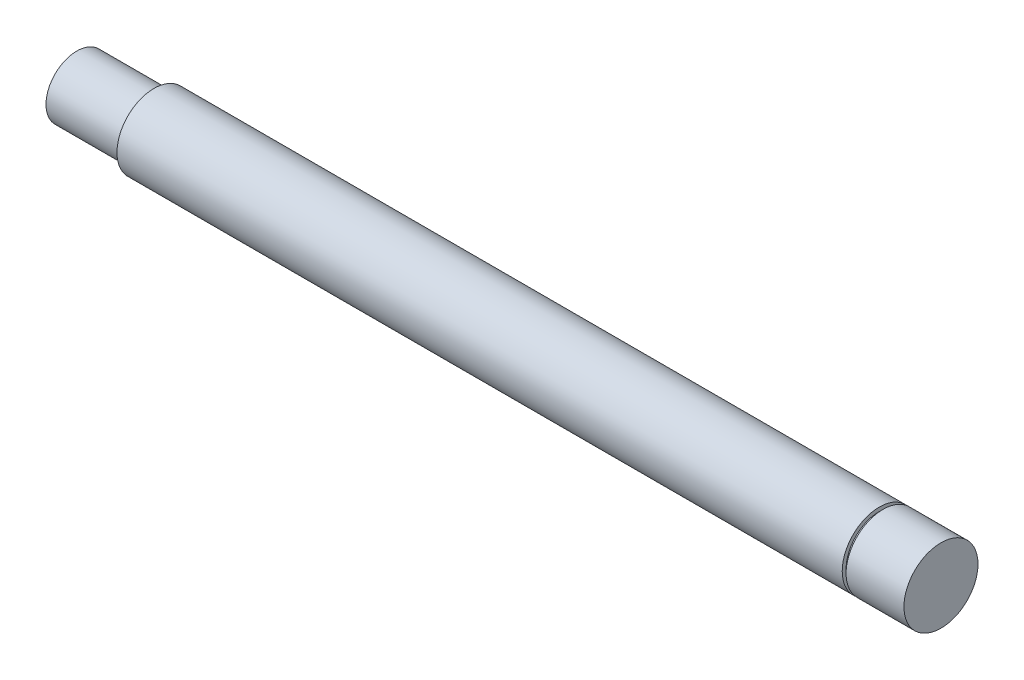
ISO-10303-21;
HEADER;
FILE_DESCRIPTION(('STEP AP214'),'2;1');
FILE_NAME('part.step','',(''),(''),'','','');
FILE_SCHEMA(('AUTOMOTIVE_DESIGN { 1 0 10303 214 1 1 1 1 }'));
ENDSEC;
DATA;
#1=APPLICATION_CONTEXT('core data for automotive mechanical design processes');
#2=APPLICATION_PROTOCOL_DEFINITION('international standard','automotive_design',2000,#1);
#3=PRODUCT_CONTEXT('',#1,'mechanical');
#4=PRODUCT('Part','Part','',(#3));
#5=PRODUCT_RELATED_PRODUCT_CATEGORY('part','',(#4));
#6=PRODUCT_DEFINITION_FORMATION('','',#4);
#7=PRODUCT_DEFINITION_CONTEXT('part definition',#1,'design');
#8=PRODUCT_DEFINITION('design','',#6,#7);
#9=PRODUCT_DEFINITION_SHAPE('','',#8);
#10=(LENGTH_UNIT() NAMED_UNIT(*) SI_UNIT(.MILLI.,.METRE.));
#11=(NAMED_UNIT(*) PLANE_ANGLE_UNIT() SI_UNIT($,.RADIAN.));
#12=(NAMED_UNIT(*) SI_UNIT($,.STERADIAN.) SOLID_ANGLE_UNIT());
#13=UNCERTAINTY_MEASURE_WITH_UNIT(LENGTH_MEASURE(1.E-05),#10,'distance_accuracy_value','');
#14=(GEOMETRIC_REPRESENTATION_CONTEXT(3) GLOBAL_UNCERTAINTY_ASSIGNED_CONTEXT((#13)) GLOBAL_UNIT_ASSIGNED_CONTEXT((#10,
#11,#12)) REPRESENTATION_CONTEXT('',''));
#15=CARTESIAN_POINT('',(0.,0.,0.));
#16=DIRECTION('',(0.,0.,1.));
#17=DIRECTION('',(1.,0.,0.));
#18=AXIS2_PLACEMENT_3D('',#15,#16,#17);
#19=CARTESIAN_POINT('',(177.8,0.,0.));
#20=DIRECTION('',(-1.,0.,0.));
#21=DIRECTION('',(0.,0.,1.));
#22=AXIS2_PLACEMENT_3D('',#19,#20,#21);
#23=CYLINDRICAL_SURFACE('',#22,7.62);
#24=CARTESIAN_POINT('',(165.1,0.,0.));
#25=DIRECTION('',(1.,0.,0.));
#26=DIRECTION('',(0.,0.,-1.));
#27=AXIS2_PLACEMENT_3D('',#24,#25,#26);
#28=CIRCLE('',#27,7.62);
#29=CARTESIAN_POINT('',(165.1,0.,-7.62));
#30=VERTEX_POINT('',#29);
#31=EDGE_CURVE('E41',#30,#30,#28,.T.);
#32=ORIENTED_EDGE('',*,*,#31,.F.);
#33=EDGE_LOOP('',(#32));
#34=FACE_BOUND('',#33,.T.);
#35=CARTESIAN_POINT('',(15.875,0.,0.));
#36=DIRECTION('',(-1.,0.,0.));
#37=DIRECTION('',(0.,0.,1.));
#38=AXIS2_PLACEMENT_3D('',#35,#36,#37);
#39=CIRCLE('',#38,7.62);
#40=CARTESIAN_POINT('',(15.875,0.,7.62));
#41=VERTEX_POINT('',#40);
#42=EDGE_CURVE('E55',#41,#41,#39,.T.);
#43=ORIENTED_EDGE('',*,*,#42,.F.);
#44=EDGE_LOOP('',(#43));
#45=FACE_BOUND('',#44,.T.);
#46=ADVANCED_FACE('F34',(#34,#45),#23,.T.);
#47=CARTESIAN_POINT('',(165.1,0.,0.));
#48=DIRECTION('',(1.,0.,0.));
#49=DIRECTION('',(0.,0.,-1.));
#50=AXIS2_PLACEMENT_3D('',#47,#48,#49);
#51=PLANE('',#50);
#52=CARTESIAN_POINT('',(165.1,0.,0.));
#53=DIRECTION('',(1.,0.,0.));
#54=DIRECTION('',(0.,0.,-1.));
#55=AXIS2_PLACEMENT_3D('',#52,#53,#54);
#56=CIRCLE('',#55,6.82625);
#57=CARTESIAN_POINT('',(165.1,0.,-6.82625));
#58=VERTEX_POINT('',#57);
#59=EDGE_CURVE('E50',#58,#58,#56,.T.);
#60=ORIENTED_EDGE('',*,*,#59,.F.);
#61=EDGE_LOOP('',(#60));
#62=FACE_BOUND('',#61,.T.);
#63=ORIENTED_EDGE('',*,*,#31,.T.);
#64=EDGE_LOOP('',(#63));
#65=FACE_BOUND('',#64,.T.);
#66=ADVANCED_FACE('F77',(#62,#65),#51,.T.);
#67=CARTESIAN_POINT('',(165.89375,0.,0.));
#68=DIRECTION('',(1.,0.,0.));
#69=DIRECTION('',(0.,0.,-1.));
#70=AXIS2_PLACEMENT_3D('',#67,#68,#69);
#71=PLANE('',#70);
#72=CARTESIAN_POINT('',(165.89375,0.,0.));
#73=DIRECTION('',(1.,0.,0.));
#74=DIRECTION('',(0.,0.,-1.));
#75=AXIS2_PLACEMENT_3D('',#72,#73,#74);
#76=CIRCLE('',#75,6.82625);
#77=CARTESIAN_POINT('',(165.89375,0.,-6.82625));
#78=VERTEX_POINT('',#77);
#79=EDGE_CURVE('E52',#78,#78,#76,.T.);
#80=ORIENTED_EDGE('',*,*,#79,.T.);
#81=EDGE_LOOP('',(#80));
#82=FACE_BOUND('',#81,.T.);
#83=CARTESIAN_POINT('',(165.89375,0.,0.));
#84=DIRECTION('',(1.,0.,0.));
#85=DIRECTION('',(0.,0.,-1.));
#86=AXIS2_PLACEMENT_3D('',#83,#84,#85);
#87=CIRCLE('',#86,7.62);
#88=CARTESIAN_POINT('',(165.89375,0.,-7.62));
#89=VERTEX_POINT('',#88);
#90=EDGE_CURVE('E45',#89,#89,#87,.T.);
#91=ORIENTED_EDGE('',*,*,#90,.F.);
#92=EDGE_LOOP('',(#91));
#93=FACE_BOUND('',#92,.T.);
#94=ADVANCED_FACE('F82',(#82,#93),#71,.F.);
#95=CARTESIAN_POINT('',(165.1,0.,0.));
#96=DIRECTION('',(1.,0.,0.));
#97=DIRECTION('',(0.,0.,-1.));
#98=AXIS2_PLACEMENT_3D('',#95,#96,#97);
#99=CYLINDRICAL_SURFACE('',#98,6.82625);
#100=ORIENTED_EDGE('',*,*,#59,.T.);
#101=EDGE_LOOP('',(#100));
#102=FACE_BOUND('',#101,.T.);
#103=ORIENTED_EDGE('',*,*,#79,.F.);
#104=EDGE_LOOP('',(#103));
#105=FACE_BOUND('',#104,.T.);
#106=ADVANCED_FACE('F91',(#102,#105),#99,.T.);
#107=CARTESIAN_POINT('',(177.8,0.,0.));
#108=DIRECTION('',(1.,0.,0.));
#109=DIRECTION('',(0.,0.,-1.));
#110=AXIS2_PLACEMENT_3D('',#107,#108,#109);
#111=PLANE('',#110);
#112=CARTESIAN_POINT('',(177.8,0.,0.));
#113=DIRECTION('',(1.,0.,0.));
#114=DIRECTION('',(0.,0.,-1.));
#115=AXIS2_PLACEMENT_3D('',#112,#113,#114);
#116=CIRCLE('',#115,7.62);
#117=CARTESIAN_POINT('',(177.8,0.,-7.62));
#118=VERTEX_POINT('',#117);
#119=EDGE_CURVE('E10',#118,#118,#116,.T.);
#120=ORIENTED_EDGE('',*,*,#119,.T.);
#121=EDGE_LOOP('',(#120));
#122=FACE_BOUND('',#121,.T.);
#123=ADVANCED_FACE('F86',(#122),#111,.T.);
#124=ORIENTED_EDGE('',*,*,#90,.T.);
#125=EDGE_LOOP('',(#124));
#126=FACE_BOUND('',#125,.T.);
#127=ORIENTED_EDGE('',*,*,#119,.F.);
#128=EDGE_LOOP('',(#127));
#129=FACE_BOUND('',#128,.T.);
#130=ADVANCED_FACE('F36',(#126,#129),#23,.T.);
#131=CARTESIAN_POINT('',(15.875,0.,0.));
#132=DIRECTION('',(-1.,0.,0.));
#133=DIRECTION('',(0.,0.,1.));
#134=AXIS2_PLACEMENT_3D('',#131,#132,#133);
#135=PLANE('',#134);
#136=CARTESIAN_POINT('',(15.875,0.,0.));
#137=DIRECTION('',(-1.,0.,0.));
#138=DIRECTION('',(0.,0.,1.));
#139=AXIS2_PLACEMENT_3D('',#136,#137,#138);
#140=CIRCLE('',#139,6.35);
#141=CARTESIAN_POINT('',(15.875,0.,6.35));
#142=VERTEX_POINT('',#141);
#143=EDGE_CURVE('E60',#142,#142,#140,.T.);
#144=ORIENTED_EDGE('',*,*,#143,.F.);
#145=EDGE_LOOP('',(#144));
#146=FACE_BOUND('',#145,.T.);
#147=ORIENTED_EDGE('',*,*,#42,.T.);
#148=EDGE_LOOP('',(#147));
#149=FACE_BOUND('',#148,.T.);
#150=ADVANCED_FACE('F70',(#146,#149),#135,.T.);
#151=CARTESIAN_POINT('',(15.875,0.,0.));
#152=DIRECTION('',(-1.,0.,0.));
#153=DIRECTION('',(0.,0.,1.));
#154=AXIS2_PLACEMENT_3D('',#151,#152,#153);
#155=CYLINDRICAL_SURFACE('',#154,6.35);
#156=ORIENTED_EDGE('',*,*,#143,.T.);
#157=EDGE_LOOP('',(#156));
#158=FACE_BOUND('',#157,.T.);
#159=CARTESIAN_POINT('',(0.,0.,0.));
#160=DIRECTION('',(-1.,0.,0.));
#161=DIRECTION('',(0.,0.,1.));
#162=AXIS2_PLACEMENT_3D('',#159,#160,#161);
#163=CIRCLE('',#162,6.35);
#164=CARTESIAN_POINT('',(0.,0.,6.35));
#165=VERTEX_POINT('',#164);
#166=EDGE_CURVE('E61',#165,#165,#163,.T.);
#167=ORIENTED_EDGE('',*,*,#166,.F.);
#168=EDGE_LOOP('',(#167));
#169=FACE_BOUND('',#168,.T.);
#170=ADVANCED_FACE('F67',(#158,#169),#155,.T.);
#171=CARTESIAN_POINT('',(0.,0.,0.));
#172=DIRECTION('',(1.,0.,0.));
#173=DIRECTION('',(0.,0.,-1.));
#174=AXIS2_PLACEMENT_3D('',#171,#172,#173);
#175=PLANE('',#174);
#176=ORIENTED_EDGE('',*,*,#166,.T.);
#177=EDGE_LOOP('',(#176));
#178=FACE_BOUND('',#177,.T.);
#179=ADVANCED_FACE('F104',(#178),#175,.F.);
#180=CLOSED_SHELL('',(#46,#66,#94,#106,#123,#130,#150,#170,#179));
#181=MANIFOLD_SOLID_BREP('B2',#180);
#182=ADVANCED_BREP_SHAPE_REPRESENTATION('',(#18,#181),#14);
#183=SHAPE_DEFINITION_REPRESENTATION(#9,#182);
ENDSEC;
END-ISO-10303-21;
